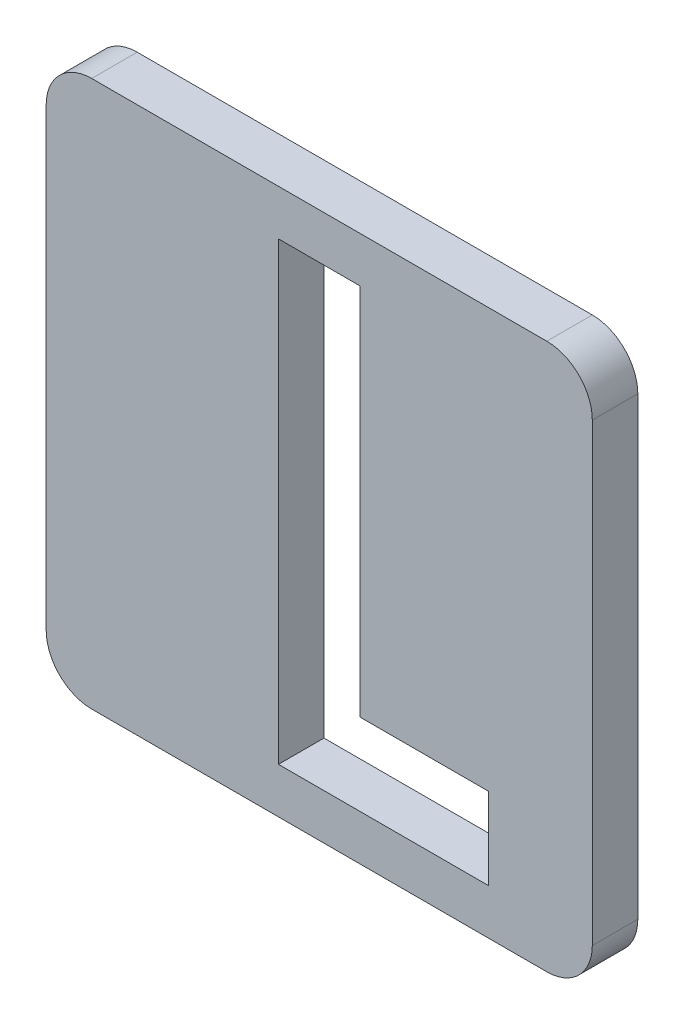
ISO-10303-21;
HEADER;
FILE_DESCRIPTION(('STEP AP214'),'2;1');
FILE_NAME('part.step','',(''),(''),'','','');
FILE_SCHEMA(('AUTOMOTIVE_DESIGN { 1 0 10303 214 1 1 1 1 }'));
ENDSEC;
DATA;
#1=APPLICATION_CONTEXT('core data for automotive mechanical design processes');
#2=APPLICATION_PROTOCOL_DEFINITION('international standard','automotive_design',2000,#1);
#3=PRODUCT_CONTEXT('',#1,'mechanical');
#4=PRODUCT('Part','Part','',(#3));
#5=PRODUCT_RELATED_PRODUCT_CATEGORY('part','',(#4));
#6=PRODUCT_DEFINITION_FORMATION('','',#4);
#7=PRODUCT_DEFINITION_CONTEXT('part definition',#1,'design');
#8=PRODUCT_DEFINITION('design','',#6,#7);
#9=PRODUCT_DEFINITION_SHAPE('','',#8);
#10=(LENGTH_UNIT() NAMED_UNIT(*) SI_UNIT(.MILLI.,.METRE.));
#11=(NAMED_UNIT(*) PLANE_ANGLE_UNIT() SI_UNIT($,.RADIAN.));
#12=(NAMED_UNIT(*) SI_UNIT($,.STERADIAN.) SOLID_ANGLE_UNIT());
#13=UNCERTAINTY_MEASURE_WITH_UNIT(LENGTH_MEASURE(1.E-05),#10,'distance_accuracy_value','');
#14=(GEOMETRIC_REPRESENTATION_CONTEXT(3) GLOBAL_UNCERTAINTY_ASSIGNED_CONTEXT((#13)) GLOBAL_UNIT_ASSIGNED_CONTEXT((#10,
#11,#12)) REPRESENTATION_CONTEXT('',''));
#15=CARTESIAN_POINT('',(0.,0.,0.));
#16=DIRECTION('',(0.,0.,1.));
#17=DIRECTION('',(1.,0.,0.));
#18=AXIS2_PLACEMENT_3D('',#15,#16,#17);
#19=CARTESIAN_POINT('',(50.,50.,10.));
#20=DIRECTION('',(0.,0.,-1.));
#21=DIRECTION('',(-1.,0.,0.));
#22=AXIS2_PLACEMENT_3D('',#19,#20,#21);
#23=PLANE('',#22);
#24=DIRECTION('',(1.,0.,0.));
#25=VECTOR('',#24,1.);
#26=CARTESIAN_POINT('',(-49.9999999999999,60.,10.));
#27=LINE('',#26,#25);
#28=CARTESIAN_POINT('',(-49.9999999999999,60.,10.));
#29=VERTEX_POINT('',#28);
#30=CARTESIAN_POINT('',(49.9999999999999,60.,10.));
#31=VERTEX_POINT('',#30);
#32=EDGE_CURVE('E187',#29,#31,#27,.T.);
#33=ORIENTED_EDGE('',*,*,#32,.F.);
#34=CARTESIAN_POINT('',(-50.,50.,10.));
#35=DIRECTION('',(0.,0.,1.));
#36=DIRECTION('',(1.,0.,0.));
#37=AXIS2_PLACEMENT_3D('',#34,#35,#36);
#38=CIRCLE('',#37,10.);
#39=CARTESIAN_POINT('',(-60.,49.9999999999999,10.));
#40=VERTEX_POINT('',#39);
#41=EDGE_CURVE('E205',#29,#40,#38,.T.);
#42=ORIENTED_EDGE('',*,*,#41,.T.);
#43=DIRECTION('',(0.,-1.,0.));
#44=VECTOR('',#43,1.);
#45=CARTESIAN_POINT('',(-60.,49.9999999999999,10.));
#46=LINE('',#45,#44);
#47=CARTESIAN_POINT('',(-60.,-49.9999999999999,10.));
#48=VERTEX_POINT('',#47);
#49=EDGE_CURVE('E203',#40,#48,#46,.T.);
#50=ORIENTED_EDGE('',*,*,#49,.T.);
#51=CARTESIAN_POINT('',(-50.,-50.,10.));
#52=DIRECTION('',(0.,0.,1.));
#53=DIRECTION('',(1.,0.,0.));
#54=AXIS2_PLACEMENT_3D('',#51,#52,#53);
#55=CIRCLE('',#54,10.);
#56=CARTESIAN_POINT('',(-49.9999999999999,-60.,10.));
#57=VERTEX_POINT('',#56);
#58=EDGE_CURVE('E201',#48,#57,#55,.T.);
#59=ORIENTED_EDGE('',*,*,#58,.T.);
#60=DIRECTION('',(1.,0.,0.));
#61=VECTOR('',#60,1.);
#62=CARTESIAN_POINT('',(-49.9999999999999,-60.,10.));
#63=LINE('',#62,#61);
#64=CARTESIAN_POINT('',(49.9999999999999,-60.,10.));
#65=VERTEX_POINT('',#64);
#66=EDGE_CURVE('E199',#57,#65,#63,.T.);
#67=ORIENTED_EDGE('',*,*,#66,.T.);
#68=CARTESIAN_POINT('',(50.,-50.,10.));
#69=DIRECTION('',(0.,0.,1.));
#70=DIRECTION('',(1.,0.,0.));
#71=AXIS2_PLACEMENT_3D('',#68,#69,#70);
#72=CIRCLE('',#71,10.);
#73=CARTESIAN_POINT('',(60.,-50.,10.));
#74=VERTEX_POINT('',#73);
#75=EDGE_CURVE('E197',#65,#74,#72,.T.);
#76=ORIENTED_EDGE('',*,*,#75,.T.);
#77=DIRECTION('',(0.,-1.,0.));
#78=VECTOR('',#77,1.);
#79=CARTESIAN_POINT('',(60.,49.9999999999999,10.));
#80=LINE('',#79,#78);
#81=CARTESIAN_POINT('',(60.,49.9999999999999,10.));
#82=VERTEX_POINT('',#81);
#83=EDGE_CURVE('E194',#82,#74,#80,.T.);
#84=ORIENTED_EDGE('',*,*,#83,.F.);
#85=CARTESIAN_POINT('',(50.,50.,10.));
#86=DIRECTION('',(0.,0.,-1.));
#87=DIRECTION('',(-1.,0.,0.));
#88=AXIS2_PLACEMENT_3D('',#85,#86,#87);
#89=CIRCLE('',#88,10.);
#90=EDGE_CURVE('E190',#31,#82,#89,.T.);
#91=ORIENTED_EDGE('',*,*,#90,.F.);
#92=EDGE_LOOP('',(#33,#42,#50,#59,#67,#76,#84,#91));
#93=FACE_BOUND('',#92,.T.);
#94=DIRECTION('',(0.,1.,0.));
#95=VECTOR('',#94,1.);
#96=CARTESIAN_POINT('',(-8.96153846153846,-50.,10.));
#97=LINE('',#96,#95);
#98=CARTESIAN_POINT('',(-8.96153846153846,-50.,10.));
#99=VERTEX_POINT('',#98);
#100=CARTESIAN_POINT('',(-8.96153846153846,50.,10.));
#101=VERTEX_POINT('',#100);
#102=EDGE_CURVE('E50',#99,#101,#97,.T.);
#103=ORIENTED_EDGE('',*,*,#102,.T.);
#104=DIRECTION('',(1.,0.,0.));
#105=VECTOR('',#104,1.);
#106=CARTESIAN_POINT('',(-8.96153846153846,50.,10.));
#107=LINE('',#106,#105);
#108=CARTESIAN_POINT('',(8.98717948717949,50.,10.));
#109=VERTEX_POINT('',#108);
#110=EDGE_CURVE('E150',#101,#109,#107,.T.);
#111=ORIENTED_EDGE('',*,*,#110,.T.);
#112=DIRECTION('',(0.,-1.,0.));
#113=VECTOR('',#112,1.);
#114=CARTESIAN_POINT('',(8.98717948717949,50.,10.));
#115=LINE('',#114,#113);
#116=CARTESIAN_POINT('',(8.98717948717949,-32.0512820512821,10.));
#117=VERTEX_POINT('',#116);
#118=EDGE_CURVE('E169',#109,#117,#115,.T.);
#119=ORIENTED_EDGE('',*,*,#118,.T.);
#120=DIRECTION('',(1.,0.,0.));
#121=VECTOR('',#120,1.);
#122=CARTESIAN_POINT('',(8.98717948717949,-32.0512820512821,10.));
#123=LINE('',#122,#121);
#124=CARTESIAN_POINT('',(37.1923076923077,-32.0512820512821,10.));
#125=VERTEX_POINT('',#124);
#126=EDGE_CURVE('E172',#117,#125,#123,.T.);
#127=ORIENTED_EDGE('',*,*,#126,.T.);
#128=DIRECTION('',(0.,-1.,0.));
#129=VECTOR('',#128,1.);
#130=CARTESIAN_POINT('',(37.1923076923077,-32.0512820512821,10.));
#131=LINE('',#130,#129);
#132=CARTESIAN_POINT('',(37.1923076923077,-50.,10.));
#133=VERTEX_POINT('',#132);
#134=EDGE_CURVE('E175',#125,#133,#131,.T.);
#135=ORIENTED_EDGE('',*,*,#134,.T.);
#136=DIRECTION('',(-1.,0.,0.));
#137=VECTOR('',#136,1.);
#138=CARTESIAN_POINT('',(37.1923076923077,-50.,10.));
#139=LINE('',#138,#137);
#140=EDGE_CURVE('E144',#133,#99,#139,.T.);
#141=ORIENTED_EDGE('',*,*,#140,.T.);
#142=EDGE_LOOP('',(#103,#111,#119,#127,#135,#141));
#143=FACE_BOUND('',#142,.T.);
#144=ADVANCED_FACE('F33',(#93,#143),#23,.F.);
#145=CARTESIAN_POINT('',(50.,50.,0.));
#146=DIRECTION('',(0.,0.,-1.));
#147=DIRECTION('',(-1.,0.,0.));
#148=AXIS2_PLACEMENT_3D('',#145,#146,#147);
#149=PLANE('',#148);
#150=DIRECTION('',(1.,0.,0.));
#151=VECTOR('',#150,1.);
#152=CARTESIAN_POINT('',(-49.9999999999999,60.,0.));
#153=LINE('',#152,#151);
#154=CARTESIAN_POINT('',(-49.9999999999999,60.,0.));
#155=VERTEX_POINT('',#154);
#156=CARTESIAN_POINT('',(49.9999999999999,60.,0.));
#157=VERTEX_POINT('',#156);
#158=EDGE_CURVE('E151',#155,#157,#153,.T.);
#159=ORIENTED_EDGE('',*,*,#158,.T.);
#160=CARTESIAN_POINT('',(50.,50.,0.));
#161=DIRECTION('',(0.,0.,-1.));
#162=DIRECTION('',(-1.,0.,0.));
#163=AXIS2_PLACEMENT_3D('',#160,#161,#162);
#164=CIRCLE('',#163,10.);
#165=CARTESIAN_POINT('',(60.,49.9999999999999,0.));
#166=VERTEX_POINT('',#165);
#167=EDGE_CURVE('E209',#157,#166,#164,.T.);
#168=ORIENTED_EDGE('',*,*,#167,.T.);
#169=DIRECTION('',(0.,-1.,0.));
#170=VECTOR('',#169,1.);
#171=CARTESIAN_POINT('',(60.,49.9999999999999,0.));
#172=LINE('',#171,#170);
#173=CARTESIAN_POINT('',(60.,-50.,0.));
#174=VERTEX_POINT('',#173);
#175=EDGE_CURVE('E212',#166,#174,#172,.T.);
#176=ORIENTED_EDGE('',*,*,#175,.T.);
#177=CARTESIAN_POINT('',(50.,-50.,0.));
#178=DIRECTION('',(0.,0.,1.));
#179=DIRECTION('',(1.,0.,0.));
#180=AXIS2_PLACEMENT_3D('',#177,#178,#179);
#181=CIRCLE('',#180,10.);
#182=CARTESIAN_POINT('',(49.9999999999999,-60.,0.));
#183=VERTEX_POINT('',#182);
#184=EDGE_CURVE('E215',#183,#174,#181,.T.);
#185=ORIENTED_EDGE('',*,*,#184,.F.);
#186=DIRECTION('',(1.,0.,0.));
#187=VECTOR('',#186,1.);
#188=CARTESIAN_POINT('',(-49.9999999999999,-60.,0.));
#189=LINE('',#188,#187);
#190=CARTESIAN_POINT('',(-49.9999999999999,-60.,0.));
#191=VERTEX_POINT('',#190);
#192=EDGE_CURVE('E218',#191,#183,#189,.T.);
#193=ORIENTED_EDGE('',*,*,#192,.F.);
#194=CARTESIAN_POINT('',(-50.,-50.,0.));
#195=DIRECTION('',(0.,0.,1.));
#196=DIRECTION('',(1.,0.,0.));
#197=AXIS2_PLACEMENT_3D('',#194,#195,#196);
#198=CIRCLE('',#197,10.);
#199=CARTESIAN_POINT('',(-60.,-49.9999999999999,0.));
#200=VERTEX_POINT('',#199);
#201=EDGE_CURVE('E220',#200,#191,#198,.T.);
#202=ORIENTED_EDGE('',*,*,#201,.F.);
#203=DIRECTION('',(0.,-1.,0.));
#204=VECTOR('',#203,1.);
#205=CARTESIAN_POINT('',(-60.,49.9999999999999,0.));
#206=LINE('',#205,#204);
#207=CARTESIAN_POINT('',(-60.,49.9999999999999,0.));
#208=VERTEX_POINT('',#207);
#209=EDGE_CURVE('E222',#208,#200,#206,.T.);
#210=ORIENTED_EDGE('',*,*,#209,.F.);
#211=CARTESIAN_POINT('',(-50.,50.,0.));
#212=DIRECTION('',(0.,0.,1.));
#213=DIRECTION('',(1.,0.,0.));
#214=AXIS2_PLACEMENT_3D('',#211,#212,#213);
#215=CIRCLE('',#214,10.);
#216=EDGE_CURVE('E191',#155,#208,#215,.T.);
#217=ORIENTED_EDGE('',*,*,#216,.F.);
#218=EDGE_LOOP('',(#159,#168,#176,#185,#193,#202,#210,#217));
#219=FACE_BOUND('',#218,.T.);
#220=DIRECTION('',(1.,0.,0.));
#221=VECTOR('',#220,1.);
#222=CARTESIAN_POINT('',(-8.96153846153846,50.,0.));
#223=LINE('',#222,#221);
#224=CARTESIAN_POINT('',(-8.96153846153846,50.,0.));
#225=VERTEX_POINT('',#224);
#226=CARTESIAN_POINT('',(8.98717948717949,50.,0.));
#227=VERTEX_POINT('',#226);
#228=EDGE_CURVE('E143',#225,#227,#223,.T.);
#229=ORIENTED_EDGE('',*,*,#228,.F.);
#230=DIRECTION('',(0.,1.,0.));
#231=VECTOR('',#230,1.);
#232=CARTESIAN_POINT('',(-8.96153846153846,-50.,0.));
#233=LINE('',#232,#231);
#234=CARTESIAN_POINT('',(-8.96153846153846,-50.,0.));
#235=VERTEX_POINT('',#234);
#236=EDGE_CURVE('E135',#235,#225,#233,.T.);
#237=ORIENTED_EDGE('',*,*,#236,.F.);
#238=DIRECTION('',(-1.,0.,0.));
#239=VECTOR('',#238,1.);
#240=CARTESIAN_POINT('',(37.1923076923077,-50.,0.));
#241=LINE('',#240,#239);
#242=CARTESIAN_POINT('',(37.1923076923077,-50.,0.));
#243=VERTEX_POINT('',#242);
#244=EDGE_CURVE('E165',#243,#235,#241,.T.);
#245=ORIENTED_EDGE('',*,*,#244,.F.);
#246=DIRECTION('',(0.,-1.,0.));
#247=VECTOR('',#246,1.);
#248=CARTESIAN_POINT('',(37.1923076923077,-32.0512820512821,0.));
#249=LINE('',#248,#247);
#250=CARTESIAN_POINT('',(37.1923076923077,-32.0512820512821,0.));
#251=VERTEX_POINT('',#250);
#252=EDGE_CURVE('E163',#251,#243,#249,.T.);
#253=ORIENTED_EDGE('',*,*,#252,.F.);
#254=DIRECTION('',(1.,0.,0.));
#255=VECTOR('',#254,1.);
#256=CARTESIAN_POINT('',(8.98717948717949,-32.0512820512821,0.));
#257=LINE('',#256,#255);
#258=CARTESIAN_POINT('',(8.98717948717949,-32.0512820512821,0.));
#259=VERTEX_POINT('',#258);
#260=EDGE_CURVE('E159',#259,#251,#257,.T.);
#261=ORIENTED_EDGE('',*,*,#260,.F.);
#262=DIRECTION('',(0.,-1.,0.));
#263=VECTOR('',#262,1.);
#264=CARTESIAN_POINT('',(8.98717948717949,50.,0.));
#265=LINE('',#264,#263);
#266=EDGE_CURVE('E157',#227,#259,#265,.T.);
#267=ORIENTED_EDGE('',*,*,#266,.F.);
#268=EDGE_LOOP('',(#229,#237,#245,#253,#261,#267));
#269=FACE_BOUND('',#268,.T.);
#270=ADVANCED_FACE('F155',(#219,#269),#149,.T.);
#271=CARTESIAN_POINT('',(-49.9999999999999,60.,10.));
#272=DIRECTION('',(0.,1.,0.));
#273=DIRECTION('',(0.,0.,1.));
#274=AXIS2_PLACEMENT_3D('',#271,#272,#273);
#275=PLANE('',#274);
#276=ORIENTED_EDGE('',*,*,#158,.F.);
#277=DIRECTION('',(0.,0.,-1.));
#278=VECTOR('',#277,1.);
#279=CARTESIAN_POINT('',(-49.9999999999999,60.,10.));
#280=LINE('',#279,#278);
#281=EDGE_CURVE('E11',#29,#155,#280,.T.);
#282=ORIENTED_EDGE('',*,*,#281,.F.);
#283=ORIENTED_EDGE('',*,*,#32,.T.);
#284=DIRECTION('',(0.,0.,-1.));
#285=VECTOR('',#284,1.);
#286=CARTESIAN_POINT('',(49.9999999999999,60.,10.));
#287=LINE('',#286,#285);
#288=EDGE_CURVE('E37',#31,#157,#287,.T.);
#289=ORIENTED_EDGE('',*,*,#288,.T.);
#290=EDGE_LOOP('',(#276,#282,#283,#289));
#291=FACE_BOUND('',#290,.T.);
#292=ADVANCED_FACE('F35',(#291),#275,.T.);
#293=CARTESIAN_POINT('',(-50.,50.,10.));
#294=DIRECTION('',(0.,0.,-1.));
#295=DIRECTION('',(-1.,0.,0.));
#296=AXIS2_PLACEMENT_3D('',#293,#294,#295);
#297=CYLINDRICAL_SURFACE('',#296,10.);
#298=ORIENTED_EDGE('',*,*,#216,.T.);
#299=DIRECTION('',(0.,0.,-1.));
#300=VECTOR('',#299,1.);
#301=CARTESIAN_POINT('',(-60.,49.9999999999999,10.));
#302=LINE('',#301,#300);
#303=EDGE_CURVE('E42',#40,#208,#302,.T.);
#304=ORIENTED_EDGE('',*,*,#303,.F.);
#305=ORIENTED_EDGE('',*,*,#41,.F.);
#306=ORIENTED_EDGE('',*,*,#281,.T.);
#307=EDGE_LOOP('',(#298,#304,#305,#306));
#308=FACE_BOUND('',#307,.T.);
#309=ADVANCED_FACE('F252',(#308),#297,.T.);
#310=CARTESIAN_POINT('',(-60.,49.9999999999999,10.));
#311=DIRECTION('',(1.,0.,0.));
#312=DIRECTION('',(0.,1.,0.));
#313=AXIS2_PLACEMENT_3D('',#310,#311,#312);
#314=PLANE('',#313);
#315=ORIENTED_EDGE('',*,*,#209,.T.);
#316=DIRECTION('',(0.,0.,-1.));
#317=VECTOR('',#316,1.);
#318=CARTESIAN_POINT('',(-60.,-49.9999999999999,10.));
#319=LINE('',#318,#317);
#320=EDGE_CURVE('E227',#48,#200,#319,.T.);
#321=ORIENTED_EDGE('',*,*,#320,.F.);
#322=ORIENTED_EDGE('',*,*,#49,.F.);
#323=ORIENTED_EDGE('',*,*,#303,.T.);
#324=EDGE_LOOP('',(#315,#321,#322,#323));
#325=FACE_BOUND('',#324,.T.);
#326=ADVANCED_FACE('F256',(#325),#314,.F.);
#327=CARTESIAN_POINT('',(-50.,-50.,10.));
#328=DIRECTION('',(0.,0.,-1.));
#329=DIRECTION('',(-1.,0.,0.));
#330=AXIS2_PLACEMENT_3D('',#327,#328,#329);
#331=CYLINDRICAL_SURFACE('',#330,10.);
#332=ORIENTED_EDGE('',*,*,#201,.T.);
#333=DIRECTION('',(0.,0.,-1.));
#334=VECTOR('',#333,1.);
#335=CARTESIAN_POINT('',(-49.9999999999999,-60.,10.));
#336=LINE('',#335,#334);
#337=EDGE_CURVE('E230',#57,#191,#336,.T.);
#338=ORIENTED_EDGE('',*,*,#337,.F.);
#339=ORIENTED_EDGE('',*,*,#58,.F.);
#340=ORIENTED_EDGE('',*,*,#320,.T.);
#341=EDGE_LOOP('',(#332,#338,#339,#340));
#342=FACE_BOUND('',#341,.T.);
#343=ADVANCED_FACE('F276',(#342),#331,.T.);
#344=CARTESIAN_POINT('',(-49.9999999999999,-60.,10.));
#345=DIRECTION('',(0.,1.,0.));
#346=DIRECTION('',(0.,0.,1.));
#347=AXIS2_PLACEMENT_3D('',#344,#345,#346);
#348=PLANE('',#347);
#349=ORIENTED_EDGE('',*,*,#192,.T.);
#350=DIRECTION('',(0.,0.,-1.));
#351=VECTOR('',#350,1.);
#352=CARTESIAN_POINT('',(49.9999999999999,-60.,10.));
#353=LINE('',#352,#351);
#354=EDGE_CURVE('E233',#65,#183,#353,.T.);
#355=ORIENTED_EDGE('',*,*,#354,.F.);
#356=ORIENTED_EDGE('',*,*,#66,.F.);
#357=ORIENTED_EDGE('',*,*,#337,.T.);
#358=EDGE_LOOP('',(#349,#355,#356,#357));
#359=FACE_BOUND('',#358,.T.);
#360=ADVANCED_FACE('F274',(#359),#348,.F.);
#361=CARTESIAN_POINT('',(50.,-50.,10.));
#362=DIRECTION('',(0.,0.,-1.));
#363=DIRECTION('',(-1.,0.,0.));
#364=AXIS2_PLACEMENT_3D('',#361,#362,#363);
#365=CYLINDRICAL_SURFACE('',#364,10.);
#366=ORIENTED_EDGE('',*,*,#184,.T.);
#367=DIRECTION('',(0.,0.,-1.));
#368=VECTOR('',#367,1.);
#369=CARTESIAN_POINT('',(60.,-50.,10.));
#370=LINE('',#369,#368);
#371=EDGE_CURVE('E236',#74,#174,#370,.T.);
#372=ORIENTED_EDGE('',*,*,#371,.F.);
#373=ORIENTED_EDGE('',*,*,#75,.F.);
#374=ORIENTED_EDGE('',*,*,#354,.T.);
#375=EDGE_LOOP('',(#366,#372,#373,#374));
#376=FACE_BOUND('',#375,.T.);
#377=ADVANCED_FACE('F270',(#376),#365,.T.);
#378=CARTESIAN_POINT('',(60.,49.9999999999999,10.));
#379=DIRECTION('',(1.,0.,0.));
#380=DIRECTION('',(0.,1.,0.));
#381=AXIS2_PLACEMENT_3D('',#378,#379,#380);
#382=PLANE('',#381);
#383=ORIENTED_EDGE('',*,*,#175,.F.);
#384=DIRECTION('',(0.,0.,-1.));
#385=VECTOR('',#384,1.);
#386=CARTESIAN_POINT('',(60.,49.9999999999999,10.));
#387=LINE('',#386,#385);
#388=EDGE_CURVE('E237',#82,#166,#387,.T.);
#389=ORIENTED_EDGE('',*,*,#388,.F.);
#390=ORIENTED_EDGE('',*,*,#83,.T.);
#391=ORIENTED_EDGE('',*,*,#371,.T.);
#392=EDGE_LOOP('',(#383,#389,#390,#391));
#393=FACE_BOUND('',#392,.T.);
#394=ADVANCED_FACE('F266',(#393),#382,.T.);
#395=CARTESIAN_POINT('',(50.,50.,10.));
#396=DIRECTION('',(0.,0.,-1.));
#397=DIRECTION('',(-1.,0.,0.));
#398=AXIS2_PLACEMENT_3D('',#395,#396,#397);
#399=CYLINDRICAL_SURFACE('',#398,10.);
#400=ORIENTED_EDGE('',*,*,#167,.F.);
#401=ORIENTED_EDGE('',*,*,#288,.F.);
#402=ORIENTED_EDGE('',*,*,#90,.T.);
#403=ORIENTED_EDGE('',*,*,#388,.T.);
#404=EDGE_LOOP('',(#400,#401,#402,#403));
#405=FACE_BOUND('',#404,.T.);
#406=ADVANCED_FACE('F245',(#405),#399,.T.);
#407=CARTESIAN_POINT('',(-8.96153846153846,-50.,0.));
#408=DIRECTION('',(1.,0.,0.));
#409=DIRECTION('',(0.,0.,-1.));
#410=AXIS2_PLACEMENT_3D('',#407,#408,#409);
#411=PLANE('',#410);
#412=ORIENTED_EDGE('',*,*,#102,.F.);
#413=DIRECTION('',(0.,0.,1.));
#414=VECTOR('',#413,1.);
#415=CARTESIAN_POINT('',(-8.96153846153846,-50.,0.));
#416=LINE('',#415,#414);
#417=EDGE_CURVE('E139',#235,#99,#416,.T.);
#418=ORIENTED_EDGE('',*,*,#417,.F.);
#419=ORIENTED_EDGE('',*,*,#236,.T.);
#420=DIRECTION('',(0.,0.,1.));
#421=VECTOR('',#420,1.);
#422=CARTESIAN_POINT('',(-8.96153846153846,50.,0.));
#423=LINE('',#422,#421);
#424=EDGE_CURVE('E138',#225,#101,#423,.T.);
#425=ORIENTED_EDGE('',*,*,#424,.T.);
#426=EDGE_LOOP('',(#412,#418,#419,#425));
#427=FACE_BOUND('',#426,.T.);
#428=ADVANCED_FACE('F137',(#427),#411,.T.);
#429=CARTESIAN_POINT('',(-8.96153846153846,50.,0.));
#430=DIRECTION('',(0.,-1.,0.));
#431=DIRECTION('',(0.,0.,-1.));
#432=AXIS2_PLACEMENT_3D('',#429,#430,#431);
#433=PLANE('',#432);
#434=ORIENTED_EDGE('',*,*,#110,.F.);
#435=ORIENTED_EDGE('',*,*,#424,.F.);
#436=ORIENTED_EDGE('',*,*,#228,.T.);
#437=DIRECTION('',(0.,0.,1.));
#438=VECTOR('',#437,1.);
#439=CARTESIAN_POINT('',(8.98717948717949,50.,0.));
#440=LINE('',#439,#438);
#441=EDGE_CURVE('E152',#227,#109,#440,.T.);
#442=ORIENTED_EDGE('',*,*,#441,.T.);
#443=EDGE_LOOP('',(#434,#435,#436,#442));
#444=FACE_BOUND('',#443,.T.);
#445=ADVANCED_FACE('F147',(#444),#433,.T.);
#446=CARTESIAN_POINT('',(8.98717948717949,50.,0.));
#447=DIRECTION('',(-1.,0.,0.));
#448=DIRECTION('',(0.,0.,1.));
#449=AXIS2_PLACEMENT_3D('',#446,#447,#448);
#450=PLANE('',#449);
#451=ORIENTED_EDGE('',*,*,#118,.F.);
#452=ORIENTED_EDGE('',*,*,#441,.F.);
#453=ORIENTED_EDGE('',*,*,#266,.T.);
#454=DIRECTION('',(0.,0.,1.));
#455=VECTOR('',#454,1.);
#456=CARTESIAN_POINT('',(8.98717948717949,-32.0512820512821,0.));
#457=LINE('',#456,#455);
#458=EDGE_CURVE('E184',#259,#117,#457,.T.);
#459=ORIENTED_EDGE('',*,*,#458,.T.);
#460=EDGE_LOOP('',(#451,#452,#453,#459));
#461=FACE_BOUND('',#460,.T.);
#462=ADVANCED_FACE('F325',(#461),#450,.T.);
#463=CARTESIAN_POINT('',(8.98717948717949,-32.0512820512821,0.));
#464=DIRECTION('',(0.,-1.,0.));
#465=DIRECTION('',(0.,0.,-1.));
#466=AXIS2_PLACEMENT_3D('',#463,#464,#465);
#467=PLANE('',#466);
#468=ORIENTED_EDGE('',*,*,#126,.F.);
#469=ORIENTED_EDGE('',*,*,#458,.F.);
#470=ORIENTED_EDGE('',*,*,#260,.T.);
#471=DIRECTION('',(0.,0.,1.));
#472=VECTOR('',#471,1.);
#473=CARTESIAN_POINT('',(37.1923076923077,-32.0512820512821,0.));
#474=LINE('',#473,#472);
#475=EDGE_CURVE('E182',#251,#125,#474,.T.);
#476=ORIENTED_EDGE('',*,*,#475,.T.);
#477=EDGE_LOOP('',(#468,#469,#470,#476));
#478=FACE_BOUND('',#477,.T.);
#479=ADVANCED_FACE('F333',(#478),#467,.T.);
#480=CARTESIAN_POINT('',(37.1923076923077,-32.0512820512821,0.));
#481=DIRECTION('',(-1.,0.,0.));
#482=DIRECTION('',(0.,0.,1.));
#483=AXIS2_PLACEMENT_3D('',#480,#481,#482);
#484=PLANE('',#483);
#485=ORIENTED_EDGE('',*,*,#134,.F.);
#486=ORIENTED_EDGE('',*,*,#475,.F.);
#487=ORIENTED_EDGE('',*,*,#252,.T.);
#488=DIRECTION('',(0.,0.,1.));
#489=VECTOR('',#488,1.);
#490=CARTESIAN_POINT('',(37.1923076923077,-50.,0.));
#491=LINE('',#490,#489);
#492=EDGE_CURVE('E58',#243,#133,#491,.T.);
#493=ORIENTED_EDGE('',*,*,#492,.T.);
#494=EDGE_LOOP('',(#485,#486,#487,#493));
#495=FACE_BOUND('',#494,.T.);
#496=ADVANCED_FACE('F343',(#495),#484,.T.);
#497=CARTESIAN_POINT('',(37.1923076923077,-50.,0.));
#498=DIRECTION('',(0.,1.,0.));
#499=DIRECTION('',(0.,0.,1.));
#500=AXIS2_PLACEMENT_3D('',#497,#498,#499);
#501=PLANE('',#500);
#502=ORIENTED_EDGE('',*,*,#140,.F.);
#503=ORIENTED_EDGE('',*,*,#492,.F.);
#504=ORIENTED_EDGE('',*,*,#244,.T.);
#505=ORIENTED_EDGE('',*,*,#417,.T.);
#506=EDGE_LOOP('',(#502,#503,#504,#505));
#507=FACE_BOUND('',#506,.T.);
#508=ADVANCED_FACE('F353',(#507),#501,.T.);
#509=CLOSED_SHELL('',(#144,#270,#292,#309,#326,#343,#360,#377,#394,#406,#428,#445,#462,#479,
#496,#508));
#510=MANIFOLD_SOLID_BREP('B2',#509);
#511=ADVANCED_BREP_SHAPE_REPRESENTATION('',(#18,#510),#14);
#512=SHAPE_DEFINITION_REPRESENTATION(#9,#511);
ENDSEC;
END-ISO-10303-21;
